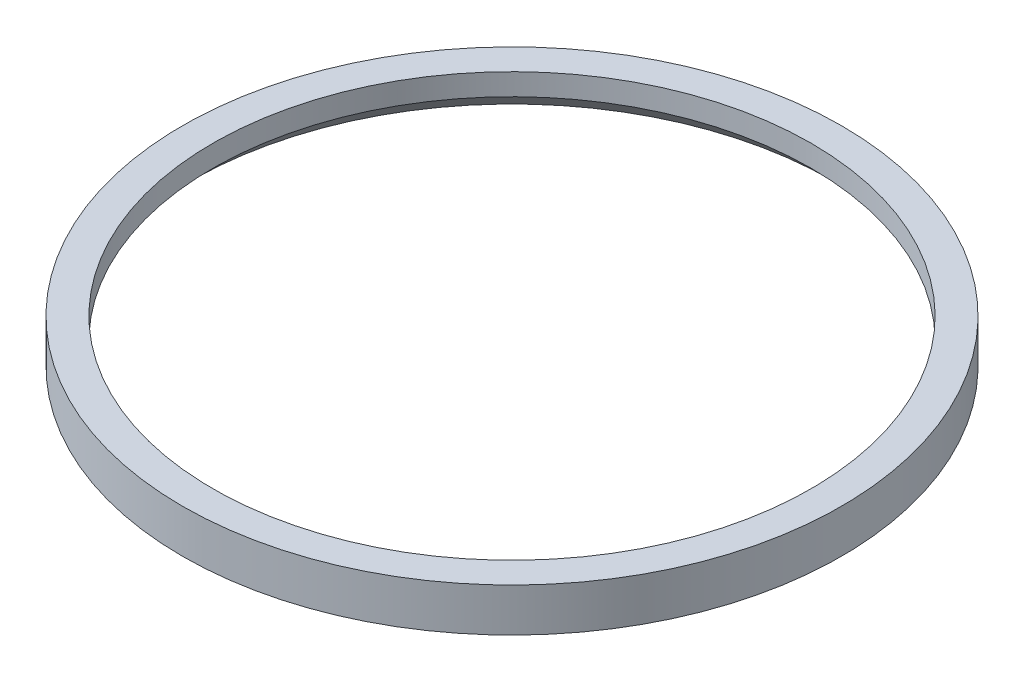
ISO-10303-21;
HEADER;
FILE_DESCRIPTION(('STEP AP214'),'2;1');
FILE_NAME('part.step','',(''),(''),'','','');
FILE_SCHEMA(('AUTOMOTIVE_DESIGN { 1 0 10303 214 1 1 1 1 }'));
ENDSEC;
DATA;
#1=APPLICATION_CONTEXT('core data for automotive mechanical design processes');
#2=APPLICATION_PROTOCOL_DEFINITION('international standard','automotive_design',2000,#1);
#3=PRODUCT_CONTEXT('',#1,'mechanical');
#4=PRODUCT('Part','Part','',(#3));
#5=PRODUCT_RELATED_PRODUCT_CATEGORY('part','',(#4));
#6=PRODUCT_DEFINITION_FORMATION('','',#4);
#7=PRODUCT_DEFINITION_CONTEXT('part definition',#1,'design');
#8=PRODUCT_DEFINITION('design','',#6,#7);
#9=PRODUCT_DEFINITION_SHAPE('','',#8);
#10=(LENGTH_UNIT() NAMED_UNIT(*) SI_UNIT(.MILLI.,.METRE.));
#11=(NAMED_UNIT(*) PLANE_ANGLE_UNIT() SI_UNIT($,.RADIAN.));
#12=(NAMED_UNIT(*) SI_UNIT($,.STERADIAN.) SOLID_ANGLE_UNIT());
#13=UNCERTAINTY_MEASURE_WITH_UNIT(LENGTH_MEASURE(1.E-05),#10,'distance_accuracy_value','');
#14=(GEOMETRIC_REPRESENTATION_CONTEXT(3) GLOBAL_UNCERTAINTY_ASSIGNED_CONTEXT((#13)) GLOBAL_UNIT_ASSIGNED_CONTEXT((#10,
#11,#12)) REPRESENTATION_CONTEXT('',''));
#15=CARTESIAN_POINT('',(0.,0.,0.));
#16=DIRECTION('',(0.,0.,1.));
#17=DIRECTION('',(1.,0.,0.));
#18=AXIS2_PLACEMENT_3D('',#15,#16,#17);
#19=CARTESIAN_POINT('',(18.5,0.,0.));
#20=DIRECTION('',(0.,-1.,0.));
#21=DIRECTION('',(0.,0.,-1.));
#22=AXIS2_PLACEMENT_3D('',#19,#20,#21);
#23=PLANE('',#22);
#24=CARTESIAN_POINT('',(0.,0.,0.));
#25=DIRECTION('',(0.,-1.,0.));
#26=DIRECTION('',(0.,0.,-1.));
#27=AXIS2_PLACEMENT_3D('',#24,#25,#26);
#28=CIRCLE('',#27,19.);
#29=CARTESIAN_POINT('',(0.,0.,-19.));
#30=VERTEX_POINT('',#29);
#31=EDGE_CURVE('E10',#30,#30,#28,.T.);
#32=ORIENTED_EDGE('',*,*,#31,.T.);
#33=EDGE_LOOP('',(#32));
#34=FACE_BOUND('',#33,.T.);
#35=CARTESIAN_POINT('',(0.,0.,0.));
#36=DIRECTION('',(0.,-1.,0.));
#37=DIRECTION('',(0.,0.,-1.));
#38=AXIS2_PLACEMENT_3D('',#35,#36,#37);
#39=CIRCLE('',#38,18.5);
#40=CARTESIAN_POINT('',(0.,0.,-18.5));
#41=VERTEX_POINT('',#40);
#42=EDGE_CURVE('E57',#41,#41,#39,.T.);
#43=ORIENTED_EDGE('',*,*,#42,.F.);
#44=EDGE_LOOP('',(#43));
#45=FACE_BOUND('',#44,.T.);
#46=ADVANCED_FACE('F38',(#34,#45),#23,.T.);
#47=CARTESIAN_POINT('',(0.,0.,0.));
#48=DIRECTION('',(0.,-1.,0.));
#49=DIRECTION('',(0.,0.,-1.));
#50=AXIS2_PLACEMENT_3D('',#47,#48,#49);
#51=CYLINDRICAL_SURFACE('',#50,19.);
#52=CARTESIAN_POINT('',(0.,2.5,0.));
#53=DIRECTION('',(0.,-1.,0.));
#54=DIRECTION('',(0.,0.,-1.));
#55=AXIS2_PLACEMENT_3D('',#52,#53,#54);
#56=CIRCLE('',#55,19.);
#57=CARTESIAN_POINT('',(0.,2.5,-19.));
#58=VERTEX_POINT('',#57);
#59=EDGE_CURVE('E44',#58,#58,#56,.T.);
#60=ORIENTED_EDGE('',*,*,#59,.T.);
#61=EDGE_LOOP('',(#60));
#62=FACE_BOUND('',#61,.T.);
#63=ORIENTED_EDGE('',*,*,#31,.F.);
#64=EDGE_LOOP('',(#63));
#65=FACE_BOUND('',#64,.T.);
#66=ADVANCED_FACE('F65',(#62,#65),#51,.T.);
#67=CARTESIAN_POINT('',(19.,2.5,0.));
#68=DIRECTION('',(0.,1.,0.));
#69=DIRECTION('',(0.,0.,1.));
#70=AXIS2_PLACEMENT_3D('',#67,#68,#69);
#71=PLANE('',#70);
#72=CARTESIAN_POINT('',(0.,2.5,0.));
#73=DIRECTION('',(0.,-1.,0.));
#74=DIRECTION('',(0.,0.,-1.));
#75=AXIS2_PLACEMENT_3D('',#72,#73,#74);
#76=CIRCLE('',#75,17.25);
#77=CARTESIAN_POINT('',(0.,2.5,-17.25));
#78=VERTEX_POINT('',#77);
#79=EDGE_CURVE('E48',#78,#78,#76,.T.);
#80=ORIENTED_EDGE('',*,*,#79,.T.);
#81=EDGE_LOOP('',(#80));
#82=FACE_BOUND('',#81,.T.);
#83=ORIENTED_EDGE('',*,*,#59,.F.);
#84=EDGE_LOOP('',(#83));
#85=FACE_BOUND('',#84,.T.);
#86=ADVANCED_FACE('F69',(#82,#85),#71,.T.);
#87=CARTESIAN_POINT('',(0.,0.,0.));
#88=DIRECTION('',(0.,-1.,0.));
#89=DIRECTION('',(0.,0.,-1.));
#90=AXIS2_PLACEMENT_3D('',#87,#88,#89);
#91=CYLINDRICAL_SURFACE('',#90,17.25);
#92=CARTESIAN_POINT('',(0.,1.25,0.));
#93=DIRECTION('',(0.,-1.,0.));
#94=DIRECTION('',(0.,0.,-1.));
#95=AXIS2_PLACEMENT_3D('',#92,#93,#94);
#96=CIRCLE('',#95,17.25);
#97=CARTESIAN_POINT('',(0.,1.25,-17.25));
#98=VERTEX_POINT('',#97);
#99=EDGE_CURVE('E52',#98,#98,#96,.T.);
#100=ORIENTED_EDGE('',*,*,#99,.T.);
#101=EDGE_LOOP('',(#100));
#102=FACE_BOUND('',#101,.T.);
#103=ORIENTED_EDGE('',*,*,#79,.F.);
#104=EDGE_LOOP('',(#103));
#105=FACE_BOUND('',#104,.T.);
#106=ADVANCED_FACE('F73',(#102,#105),#91,.F.);
#107=CARTESIAN_POINT('',(0.,1.25,0.));
#108=DIRECTION('',(0.,-1.,0.));
#109=DIRECTION('',(0.,0.,-1.));
#110=AXIS2_PLACEMENT_3D('',#107,#108,#109);
#111=CONICAL_SURFACE('',#110,17.25,0.785398163397455);
#112=ORIENTED_EDGE('',*,*,#42,.T.);
#113=EDGE_LOOP('',(#112));
#114=FACE_BOUND('',#113,.T.);
#115=ORIENTED_EDGE('',*,*,#99,.F.);
#116=EDGE_LOOP('',(#115));
#117=FACE_BOUND('',#116,.T.);
#118=ADVANCED_FACE('F61',(#114,#117),#111,.F.);
#119=CLOSED_SHELL('',(#46,#66,#86,#106,#118));
#120=MANIFOLD_SOLID_BREP('B2',#119);
#121=ADVANCED_BREP_SHAPE_REPRESENTATION('',(#18,#120),#14);
#122=SHAPE_DEFINITION_REPRESENTATION(#9,#121);
ENDSEC;
END-ISO-10303-21;
